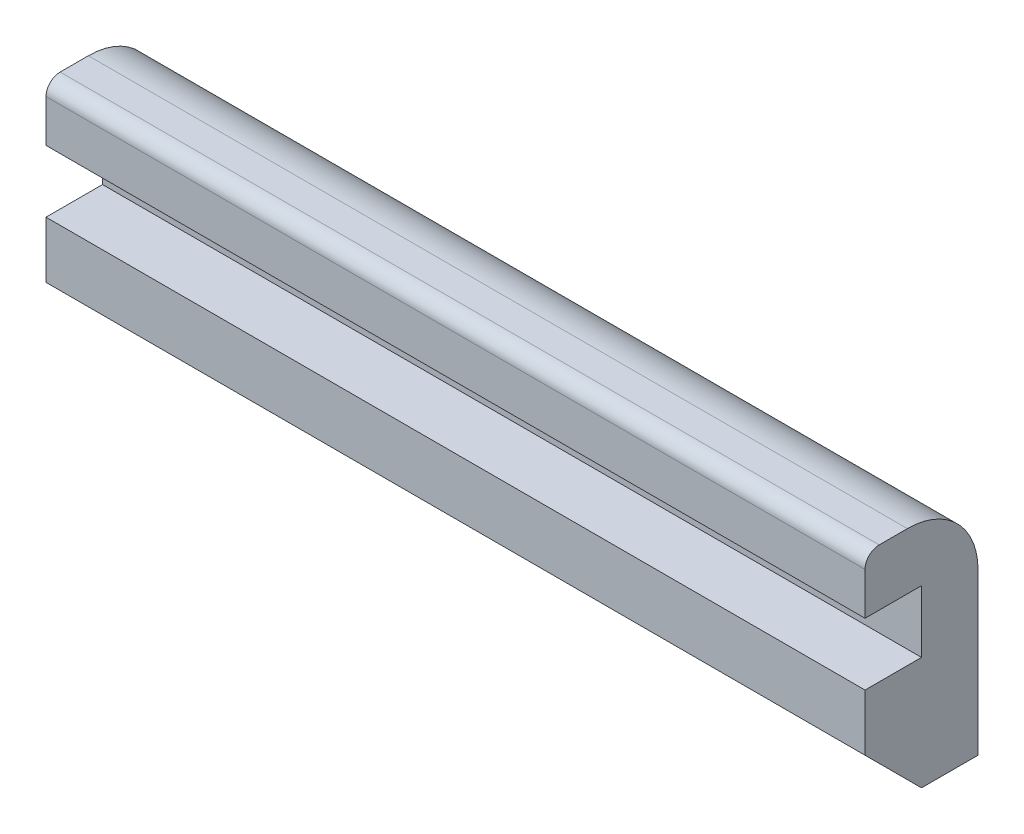
ISO-10303-21;
HEADER;
FILE_DESCRIPTION(('STEP AP214'),'2;1');
FILE_NAME('part.step','',(''),(''),'','','');
FILE_SCHEMA(('AUTOMOTIVE_DESIGN { 1 0 10303 214 1 1 1 1 }'));
ENDSEC;
DATA;
#1=APPLICATION_CONTEXT('core data for automotive mechanical design processes');
#2=APPLICATION_PROTOCOL_DEFINITION('international standard','automotive_design',2000,#1);
#3=PRODUCT_CONTEXT('',#1,'mechanical');
#4=PRODUCT('Part','Part','',(#3));
#5=PRODUCT_RELATED_PRODUCT_CATEGORY('part','',(#4));
#6=PRODUCT_DEFINITION_FORMATION('','',#4);
#7=PRODUCT_DEFINITION_CONTEXT('part definition',#1,'design');
#8=PRODUCT_DEFINITION('design','',#6,#7);
#9=PRODUCT_DEFINITION_SHAPE('','',#8);
#10=(LENGTH_UNIT() NAMED_UNIT(*) SI_UNIT(.MILLI.,.METRE.));
#11=(NAMED_UNIT(*) PLANE_ANGLE_UNIT() SI_UNIT($,.RADIAN.));
#12=(NAMED_UNIT(*) SI_UNIT($,.STERADIAN.) SOLID_ANGLE_UNIT());
#13=UNCERTAINTY_MEASURE_WITH_UNIT(LENGTH_MEASURE(1.E-05),#10,'distance_accuracy_value','');
#14=(GEOMETRIC_REPRESENTATION_CONTEXT(3) GLOBAL_UNCERTAINTY_ASSIGNED_CONTEXT((#13)) GLOBAL_UNIT_ASSIGNED_CONTEXT((#10,
#11,#12)) REPRESENTATION_CONTEXT('',''));
#15=CARTESIAN_POINT('',(0.,0.,0.));
#16=DIRECTION('',(0.,0.,1.));
#17=DIRECTION('',(1.,0.,0.));
#18=AXIS2_PLACEMENT_3D('',#15,#16,#17);
#19=CARTESIAN_POINT('',(-19.5,2.,-77.5));
#20=DIRECTION('',(0.,0.,1.));
#21=DIRECTION('',(1.,0.,0.));
#22=AXIS2_PLACEMENT_3D('',#19,#20,#21);
#23=PLANE('',#22);
#24=DIRECTION('',(1.,0.,0.));
#25=VECTOR('',#24,1.);
#26=CARTESIAN_POINT('',(-19.5,31.8,-77.5));
#27=LINE('',#26,#25);
#28=CARTESIAN_POINT('',(-14.5,31.8,-77.5));
#29=VERTEX_POINT('',#28);
#30=CARTESIAN_POINT('',(14.5,31.8,-77.5));
#31=VERTEX_POINT('',#30);
#32=EDGE_CURVE('E98',#29,#31,#27,.T.);
#33=ORIENTED_EDGE('',*,*,#32,.F.);
#34=DIRECTION('',(0.,-1.,0.));
#35=VECTOR('',#34,1.);
#36=CARTESIAN_POINT('',(-14.5,2.,-77.5));
#37=LINE('',#36,#35);
#38=CARTESIAN_POINT('',(-14.5,37.5,-77.5));
#39=VERTEX_POINT('',#38);
#40=EDGE_CURVE('E179',#39,#29,#37,.T.);
#41=ORIENTED_EDGE('',*,*,#40,.F.);
#42=DIRECTION('',(-1.,0.,0.));
#43=VECTOR('',#42,1.);
#44=CARTESIAN_POINT('',(19.5,37.5,-77.5));
#45=LINE('',#44,#43);
#46=CARTESIAN_POINT('',(14.5,37.5,-77.5));
#47=VERTEX_POINT('',#46);
#48=EDGE_CURVE('E241',#39,#47,#45,.F.);
#49=ORIENTED_EDGE('',*,*,#48,.T.);
#50=DIRECTION('',(0.,1.,0.));
#51=VECTOR('',#50,1.);
#52=CARTESIAN_POINT('',(14.5,2.,-77.5));
#53=LINE('',#52,#51);
#54=EDGE_CURVE('E208',#31,#47,#53,.T.);
#55=ORIENTED_EDGE('',*,*,#54,.F.);
#56=EDGE_LOOP('',(#33,#41,#49,#55));
#57=FACE_BOUND('',#56,.T.);
#58=ADVANCED_FACE('F83',(#57),#23,.F.);
#59=CARTESIAN_POINT('',(-14.5,40.,-77.5353460179952));
#60=DIRECTION('',(-1.,0.,0.));
#61=DIRECTION('',(0.,-1.,0.));
#62=AXIS2_PLACEMENT_3D('',#59,#60,#61);
#63=PLANE('',#62);
#64=ORIENTED_EDGE('',*,*,#40,.T.);
#65=DIRECTION('',(0.,0.,1.));
#66=VECTOR('',#65,1.);
#67=CARTESIAN_POINT('',(-14.5,31.8,-77.5353460179952));
#68=LINE('',#67,#66);
#69=CARTESIAN_POINT('',(-14.5,31.8,-75.5));
#70=VERTEX_POINT('',#69);
#71=EDGE_CURVE('E167',#29,#70,#68,.T.);
#72=ORIENTED_EDGE('',*,*,#71,.T.);
#73=DIRECTION('',(0.,0.707106781186549,0.707106781186546));
#74=VECTOR('',#73,1.);
#75=CARTESIAN_POINT('',(-14.5,33.8,-73.5));
#76=LINE('',#75,#74);
#77=CARTESIAN_POINT('',(-14.5,33.8,-73.5));
#78=VERTEX_POINT('',#77);
#79=EDGE_CURVE('E176',#70,#78,#76,.T.);
#80=ORIENTED_EDGE('',*,*,#79,.T.);
#81=DIRECTION('',(0.,1.,0.));
#82=VECTOR('',#81,1.);
#83=CARTESIAN_POINT('',(-14.5,35.8,-73.5));
#84=LINE('',#83,#82);
#85=CARTESIAN_POINT('',(-14.5,35.8,-73.5));
#86=VERTEX_POINT('',#85);
#87=EDGE_CURVE('E185',#78,#86,#84,.T.);
#88=ORIENTED_EDGE('',*,*,#87,.T.);
#89=DIRECTION('',(0.,0.,-1.));
#90=VECTOR('',#89,1.);
#91=CARTESIAN_POINT('',(-14.5,35.8,81.9721359549996));
#92=LINE('',#91,#90);
#93=CARTESIAN_POINT('',(-14.5,35.8,-75.5));
#94=VERTEX_POINT('',#93);
#95=EDGE_CURVE('E188',#86,#94,#92,.T.);
#96=ORIENTED_EDGE('',*,*,#95,.T.);
#97=DIRECTION('',(0.,1.,0.));
#98=VECTOR('',#97,1.);
#99=CARTESIAN_POINT('',(-14.5,40.,-75.5));
#100=LINE('',#99,#98);
#101=CARTESIAN_POINT('',(-14.5,38.,-75.5));
#102=VERTEX_POINT('',#101);
#103=EDGE_CURVE('E196',#94,#102,#100,.T.);
#104=ORIENTED_EDGE('',*,*,#103,.T.);
#105=DIRECTION('',(0.,0.,1.));
#106=VECTOR('',#105,1.);
#107=CARTESIAN_POINT('',(-14.5,38.,81.9721359549996));
#108=LINE('',#107,#106);
#109=CARTESIAN_POINT('',(-14.5,38.,-73.5));
#110=VERTEX_POINT('',#109);
#111=EDGE_CURVE('E198',#102,#110,#108,.T.);
#112=ORIENTED_EDGE('',*,*,#111,.T.);
#113=DIRECTION('',(0.,1.,0.));
#114=VECTOR('',#113,1.);
#115=CARTESIAN_POINT('',(-14.5,40.,-73.5));
#116=LINE('',#115,#114);
#117=CARTESIAN_POINT('',(-14.5,39.5,-73.5));
#118=VERTEX_POINT('',#117);
#119=EDGE_CURVE('E200',#110,#118,#116,.T.);
#120=ORIENTED_EDGE('',*,*,#119,.T.);
#121=CARTESIAN_POINT('',(-14.5,39.5,-74.));
#122=DIRECTION('',(-1.,0.,0.));
#123=DIRECTION('',(0.,-1.,0.));
#124=AXIS2_PLACEMENT_3D('',#121,#122,#123);
#125=CIRCLE('',#124,0.5);
#126=CARTESIAN_POINT('',(-14.5,40.,-74.));
#127=VERTEX_POINT('',#126);
#128=EDGE_CURVE('E202',#127,#118,#125,.F.);
#129=ORIENTED_EDGE('',*,*,#128,.F.);
#130=DIRECTION('',(0.,0.,1.));
#131=VECTOR('',#130,1.);
#132=CARTESIAN_POINT('',(-14.5,40.,-77.5353460179952));
#133=LINE('',#132,#131);
#134=CARTESIAN_POINT('',(-14.5,40.,-75.));
#135=VERTEX_POINT('',#134);
#136=EDGE_CURVE('E190',#135,#127,#133,.T.);
#137=ORIENTED_EDGE('',*,*,#136,.F.);
#138=CARTESIAN_POINT('',(-14.5,37.5,-75.));
#139=DIRECTION('',(-1.,0.,0.));
#140=DIRECTION('',(0.,-1.,0.));
#141=AXIS2_PLACEMENT_3D('',#138,#139,#140);
#142=CIRCLE('',#141,2.5);
#143=EDGE_CURVE('E205',#39,#135,#142,.F.);
#144=ORIENTED_EDGE('',*,*,#143,.F.);
#145=EDGE_LOOP('',(#64,#72,#80,#88,#96,#104,#112,#120,#129,#137,#144));
#146=FACE_BOUND('',#145,.T.);
#147=ADVANCED_FACE('F175',(#146),#63,.T.);
#148=CARTESIAN_POINT('',(14.5,0.,-77.5353460179952));
#149=DIRECTION('',(1.,0.,0.));
#150=DIRECTION('',(0.,0.,-1.));
#151=AXIS2_PLACEMENT_3D('',#148,#149,#150);
#152=PLANE('',#151);
#153=DIRECTION('',(0.,-0.707106781186549,-0.707106781186546));
#154=VECTOR('',#153,1.);
#155=CARTESIAN_POINT('',(14.5,33.8,-73.5));
#156=LINE('',#155,#154);
#157=CARTESIAN_POINT('',(14.5,33.8,-73.5));
#158=VERTEX_POINT('',#157);
#159=CARTESIAN_POINT('',(14.5,31.8,-75.5));
#160=VERTEX_POINT('',#159);
#161=EDGE_CURVE('E171',#158,#160,#156,.T.);
#162=ORIENTED_EDGE('',*,*,#161,.T.);
#163=DIRECTION('',(0.,0.,-1.));
#164=VECTOR('',#163,1.);
#165=CARTESIAN_POINT('',(14.5,31.8,-77.5353460179952));
#166=LINE('',#165,#164);
#167=EDGE_CURVE('E12',#160,#31,#166,.T.);
#168=ORIENTED_EDGE('',*,*,#167,.T.);
#169=ORIENTED_EDGE('',*,*,#54,.T.);
#170=CARTESIAN_POINT('',(14.5,37.5,-75.));
#171=DIRECTION('',(1.,0.,0.));
#172=DIRECTION('',(0.,0.,-1.));
#173=AXIS2_PLACEMENT_3D('',#170,#171,#172);
#174=CIRCLE('',#173,2.5);
#175=CARTESIAN_POINT('',(14.5,40.,-75.));
#176=VERTEX_POINT('',#175);
#177=EDGE_CURVE('E210',#176,#47,#174,.F.);
#178=ORIENTED_EDGE('',*,*,#177,.F.);
#179=DIRECTION('',(0.,0.,1.));
#180=VECTOR('',#179,1.);
#181=CARTESIAN_POINT('',(14.5,40.,-77.5353460179952));
#182=LINE('',#181,#180);
#183=CARTESIAN_POINT('',(14.5,40.,-74.));
#184=VERTEX_POINT('',#183);
#185=EDGE_CURVE('E186',#176,#184,#182,.T.);
#186=ORIENTED_EDGE('',*,*,#185,.T.);
#187=CARTESIAN_POINT('',(14.5,39.5,-74.));
#188=DIRECTION('',(1.,0.,0.));
#189=DIRECTION('',(0.,0.,-1.));
#190=AXIS2_PLACEMENT_3D('',#187,#188,#189);
#191=CIRCLE('',#190,0.5);
#192=CARTESIAN_POINT('',(14.5,39.5,-73.5));
#193=VERTEX_POINT('',#192);
#194=EDGE_CURVE('E213',#193,#184,#191,.F.);
#195=ORIENTED_EDGE('',*,*,#194,.F.);
#196=DIRECTION('',(0.,-1.,0.));
#197=VECTOR('',#196,1.);
#198=CARTESIAN_POINT('',(14.5,40.,-73.5));
#199=LINE('',#198,#197);
#200=CARTESIAN_POINT('',(14.5,38.,-73.5));
#201=VERTEX_POINT('',#200);
#202=EDGE_CURVE('E216',#193,#201,#199,.T.);
#203=ORIENTED_EDGE('',*,*,#202,.T.);
#204=DIRECTION('',(0.,0.,-1.));
#205=VECTOR('',#204,1.);
#206=CARTESIAN_POINT('',(14.5,38.,81.9721359549996));
#207=LINE('',#206,#205);
#208=CARTESIAN_POINT('',(14.5,38.,-75.5));
#209=VERTEX_POINT('',#208);
#210=EDGE_CURVE('E218',#201,#209,#207,.T.);
#211=ORIENTED_EDGE('',*,*,#210,.T.);
#212=DIRECTION('',(0.,-1.,0.));
#213=VECTOR('',#212,1.);
#214=CARTESIAN_POINT('',(14.5,40.,-75.5));
#215=LINE('',#214,#213);
#216=CARTESIAN_POINT('',(14.5,35.8,-75.5));
#217=VERTEX_POINT('',#216);
#218=EDGE_CURVE('E220',#209,#217,#215,.T.);
#219=ORIENTED_EDGE('',*,*,#218,.T.);
#220=DIRECTION('',(0.,0.,1.));
#221=VECTOR('',#220,1.);
#222=CARTESIAN_POINT('',(14.5,35.8,81.9721359549996));
#223=LINE('',#222,#221);
#224=CARTESIAN_POINT('',(14.5,35.8,-73.5));
#225=VERTEX_POINT('',#224);
#226=EDGE_CURVE('E222',#217,#225,#223,.T.);
#227=ORIENTED_EDGE('',*,*,#226,.T.);
#228=DIRECTION('',(0.,-1.,0.));
#229=VECTOR('',#228,1.);
#230=CARTESIAN_POINT('',(14.5,35.8,-73.5));
#231=LINE('',#230,#229);
#232=EDGE_CURVE('E105',#225,#158,#231,.T.);
#233=ORIENTED_EDGE('',*,*,#232,.T.);
#234=EDGE_LOOP('',(#162,#168,#169,#178,#186,#195,#203,#211,#219,#227,#233));
#235=FACE_BOUND('',#234,.T.);
#236=ADVANCED_FACE('F266',(#235),#152,.T.);
#237=CARTESIAN_POINT('',(0.,40.,-75.5));
#238=DIRECTION('',(0.,0.,-1.));
#239=DIRECTION('',(-1.,0.,0.));
#240=AXIS2_PLACEMENT_3D('',#237,#238,#239);
#241=PLANE('',#240);
#242=ORIENTED_EDGE('',*,*,#218,.F.);
#243=DIRECTION('',(1.,0.,0.));
#244=VECTOR('',#243,1.);
#245=CARTESIAN_POINT('',(-15.5,38.,-75.5));
#246=LINE('',#245,#244);
#247=EDGE_CURVE('E235',#102,#209,#246,.T.);
#248=ORIENTED_EDGE('',*,*,#247,.F.);
#249=ORIENTED_EDGE('',*,*,#103,.F.);
#250=DIRECTION('',(-1.,0.,0.));
#251=VECTOR('',#250,1.);
#252=CARTESIAN_POINT('',(-15.5,35.8,-75.5));
#253=LINE('',#252,#251);
#254=EDGE_CURVE('E232',#217,#94,#253,.T.);
#255=ORIENTED_EDGE('',*,*,#254,.F.);
#256=EDGE_LOOP('',(#242,#248,#249,#255));
#257=FACE_BOUND('',#256,.T.);
#258=ADVANCED_FACE('F278',(#257),#241,.F.);
#259=CARTESIAN_POINT('',(0.,40.,0.));
#260=DIRECTION('',(0.,1.,0.));
#261=DIRECTION('',(0.,0.,1.));
#262=AXIS2_PLACEMENT_3D('',#259,#260,#261);
#263=PLANE('',#262);
#264=DIRECTION('',(-1.,0.,0.));
#265=VECTOR('',#264,1.);
#266=CARTESIAN_POINT('',(15.5,40.,-74.));
#267=LINE('',#266,#265);
#268=EDGE_CURVE('E244',#127,#184,#267,.F.);
#269=ORIENTED_EDGE('',*,*,#268,.T.);
#270=ORIENTED_EDGE('',*,*,#185,.F.);
#271=DIRECTION('',(-1.,0.,0.));
#272=VECTOR('',#271,1.);
#273=CARTESIAN_POINT('',(-19.5,40.,-75.));
#274=LINE('',#273,#272);
#275=EDGE_CURVE('E238',#176,#135,#274,.T.);
#276=ORIENTED_EDGE('',*,*,#275,.T.);
#277=ORIENTED_EDGE('',*,*,#136,.T.);
#278=EDGE_LOOP('',(#269,#270,#276,#277));
#279=FACE_BOUND('',#278,.T.);
#280=ADVANCED_FACE('F257',(#279),#263,.T.);
#281=CARTESIAN_POINT('',(15.5,35.8,81.9721359549996));
#282=DIRECTION('',(0.,-1.,0.));
#283=DIRECTION('',(0.,0.,-1.));
#284=AXIS2_PLACEMENT_3D('',#281,#282,#283);
#285=PLANE('',#284);
#286=ORIENTED_EDGE('',*,*,#226,.F.);
#287=ORIENTED_EDGE('',*,*,#254,.T.);
#288=ORIENTED_EDGE('',*,*,#95,.F.);
#289=DIRECTION('',(-1.,0.,0.));
#290=VECTOR('',#289,1.);
#291=CARTESIAN_POINT('',(21.9721359549996,35.8,-73.5));
#292=LINE('',#291,#290);
#293=EDGE_CURVE('E170',#225,#86,#292,.T.);
#294=ORIENTED_EDGE('',*,*,#293,.F.);
#295=EDGE_LOOP('',(#286,#287,#288,#294));
#296=FACE_BOUND('',#295,.T.);
#297=ADVANCED_FACE('F274',(#296),#285,.F.);
#298=CARTESIAN_POINT('',(15.5,38.,81.9721359549996));
#299=DIRECTION('',(0.,1.,0.));
#300=DIRECTION('',(0.,0.,1.));
#301=AXIS2_PLACEMENT_3D('',#298,#299,#300);
#302=PLANE('',#301);
#303=ORIENTED_EDGE('',*,*,#210,.F.);
#304=DIRECTION('',(-1.,0.,0.));
#305=VECTOR('',#304,1.);
#306=CARTESIAN_POINT('',(21.9721359549996,38.,-73.5));
#307=LINE('',#306,#305);
#308=EDGE_CURVE('E228',#201,#110,#307,.T.);
#309=ORIENTED_EDGE('',*,*,#308,.T.);
#310=ORIENTED_EDGE('',*,*,#111,.F.);
#311=ORIENTED_EDGE('',*,*,#247,.T.);
#312=EDGE_LOOP('',(#303,#309,#310,#311));
#313=FACE_BOUND('',#312,.T.);
#314=ADVANCED_FACE('F283',(#313),#302,.F.);
#315=CARTESIAN_POINT('',(21.9721359549996,40.,-73.5));
#316=DIRECTION('',(0.,0.,-1.));
#317=DIRECTION('',(0.,1.,0.));
#318=AXIS2_PLACEMENT_3D('',#315,#316,#317);
#319=PLANE('',#318);
#320=ORIENTED_EDGE('',*,*,#202,.F.);
#321=DIRECTION('',(-1.,0.,0.));
#322=VECTOR('',#321,1.);
#323=CARTESIAN_POINT('',(-15.5,39.5,-73.5));
#324=LINE('',#323,#322);
#325=EDGE_CURVE('E91',#193,#118,#324,.T.);
#326=ORIENTED_EDGE('',*,*,#325,.T.);
#327=ORIENTED_EDGE('',*,*,#119,.F.);
#328=ORIENTED_EDGE('',*,*,#308,.F.);
#329=EDGE_LOOP('',(#320,#326,#327,#328));
#330=FACE_BOUND('',#329,.T.);
#331=ADVANCED_FACE('F251',(#330),#319,.F.);
#332=CARTESIAN_POINT('',(21.9721359549996,35.8,-73.5));
#333=DIRECTION('',(0.,0.,-1.));
#334=DIRECTION('',(0.,1.,0.));
#335=AXIS2_PLACEMENT_3D('',#332,#333,#334);
#336=PLANE('',#335);
#337=ORIENTED_EDGE('',*,*,#232,.F.);
#338=ORIENTED_EDGE('',*,*,#293,.T.);
#339=ORIENTED_EDGE('',*,*,#87,.F.);
#340=DIRECTION('',(-1.,0.,0.));
#341=VECTOR('',#340,1.);
#342=CARTESIAN_POINT('',(21.9721359549996,33.8,-73.5));
#343=LINE('',#342,#341);
#344=EDGE_CURVE('E184',#158,#78,#343,.T.);
#345=ORIENTED_EDGE('',*,*,#344,.F.);
#346=EDGE_LOOP('',(#337,#338,#339,#345));
#347=FACE_BOUND('',#346,.T.);
#348=ADVANCED_FACE('F268',(#347),#336,.F.);
#349=CARTESIAN_POINT('',(21.9721359549996,33.8,-73.5));
#350=DIRECTION('',(0.,0.707106781186546,-0.707106781186549));
#351=DIRECTION('',(0.,0.707106781186549,0.707106781186546));
#352=AXIS2_PLACEMENT_3D('',#349,#350,#351);
#353=PLANE('',#352);
#354=ORIENTED_EDGE('',*,*,#161,.F.);
#355=ORIENTED_EDGE('',*,*,#344,.T.);
#356=ORIENTED_EDGE('',*,*,#79,.F.);
#357=DIRECTION('',(-1.,0.,0.));
#358=VECTOR('',#357,1.);
#359=CARTESIAN_POINT('',(21.9721359549996,31.8,-75.5));
#360=LINE('',#359,#358);
#361=EDGE_CURVE('E164',#160,#70,#360,.T.);
#362=ORIENTED_EDGE('',*,*,#361,.F.);
#363=EDGE_LOOP('',(#354,#355,#356,#362));
#364=FACE_BOUND('',#363,.T.);
#365=ADVANCED_FACE('F182',(#364),#353,.F.);
#366=CARTESIAN_POINT('',(0.,37.5,-75.));
#367=DIRECTION('',(1.,0.,0.));
#368=DIRECTION('',(0.,0.,-1.));
#369=AXIS2_PLACEMENT_3D('',#366,#367,#368);
#370=CYLINDRICAL_SURFACE('',#369,2.5);
#371=ORIENTED_EDGE('',*,*,#275,.F.);
#372=ORIENTED_EDGE('',*,*,#177,.T.);
#373=ORIENTED_EDGE('',*,*,#48,.F.);
#374=ORIENTED_EDGE('',*,*,#143,.T.);
#375=EDGE_LOOP('',(#371,#372,#373,#374));
#376=FACE_BOUND('',#375,.T.);
#377=ADVANCED_FACE('F262',(#376),#370,.T.);
#378=CARTESIAN_POINT('',(21.9721359549996,39.5,-74.));
#379=DIRECTION('',(1.,0.,0.));
#380=DIRECTION('',(0.,0.,-1.));
#381=AXIS2_PLACEMENT_3D('',#378,#379,#380);
#382=CYLINDRICAL_SURFACE('',#381,0.5);
#383=ORIENTED_EDGE('',*,*,#325,.F.);
#384=ORIENTED_EDGE('',*,*,#194,.T.);
#385=ORIENTED_EDGE('',*,*,#268,.F.);
#386=ORIENTED_EDGE('',*,*,#128,.T.);
#387=EDGE_LOOP('',(#383,#384,#385,#386));
#388=FACE_BOUND('',#387,.T.);
#389=ADVANCED_FACE('F85',(#388),#382,.T.);
#390=CARTESIAN_POINT('',(0.,31.8,-77.5353460179952));
#391=DIRECTION('',(0.,-1.,0.));
#392=DIRECTION('',(0.,0.,-1.));
#393=AXIS2_PLACEMENT_3D('',#390,#391,#392);
#394=PLANE('',#393);
#395=ORIENTED_EDGE('',*,*,#32,.T.);
#396=ORIENTED_EDGE('',*,*,#167,.F.);
#397=ORIENTED_EDGE('',*,*,#361,.T.);
#398=ORIENTED_EDGE('',*,*,#71,.F.);
#399=EDGE_LOOP('',(#395,#396,#397,#398));
#400=FACE_BOUND('',#399,.T.);
#401=ADVANCED_FACE('F166',(#400),#394,.T.);
#402=CLOSED_SHELL('',(#58,#147,#236,#258,#280,#297,#314,#331,#348,#365,#377,#389,#401));
#403=MANIFOLD_SOLID_BREP('B2',#402);
#404=ADVANCED_BREP_SHAPE_REPRESENTATION('',(#18,#403),#14);
#405=SHAPE_DEFINITION_REPRESENTATION(#9,#404);
ENDSEC;
END-ISO-10303-21;
